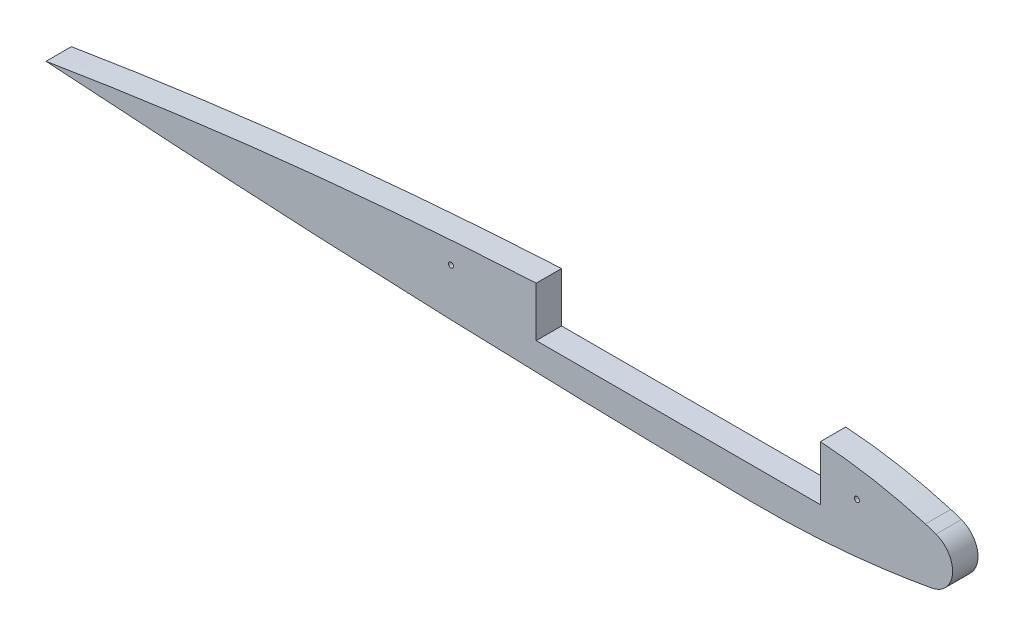
ISO-10303-21;
HEADER;
FILE_DESCRIPTION(('STEP AP214'),'2;1');
FILE_NAME('part.step','',(''),(''),'','','');
FILE_SCHEMA(('AUTOMOTIVE_DESIGN { 1 0 10303 214 1 1 1 1 }'));
ENDSEC;
DATA;
#1=APPLICATION_CONTEXT('core data for automotive mechanical design processes');
#2=APPLICATION_PROTOCOL_DEFINITION('international standard','automotive_design',2000,#1);
#3=PRODUCT_CONTEXT('',#1,'mechanical');
#4=PRODUCT('Part','Part','',(#3));
#5=PRODUCT_RELATED_PRODUCT_CATEGORY('part','',(#4));
#6=PRODUCT_DEFINITION_FORMATION('','',#4);
#7=PRODUCT_DEFINITION_CONTEXT('part definition',#1,'design');
#8=PRODUCT_DEFINITION('design','',#6,#7);
#9=PRODUCT_DEFINITION_SHAPE('','',#8);
#10=(LENGTH_UNIT() NAMED_UNIT(*) SI_UNIT(.MILLI.,.METRE.));
#11=(NAMED_UNIT(*) PLANE_ANGLE_UNIT() SI_UNIT($,.RADIAN.));
#12=(NAMED_UNIT(*) SI_UNIT($,.STERADIAN.) SOLID_ANGLE_UNIT());
#13=UNCERTAINTY_MEASURE_WITH_UNIT(LENGTH_MEASURE(1.E-05),#10,'distance_accuracy_value','');
#14=(GEOMETRIC_REPRESENTATION_CONTEXT(3) GLOBAL_UNCERTAINTY_ASSIGNED_CONTEXT((#13)) GLOBAL_UNIT_ASSIGNED_CONTEXT((#10,
#11,#12)) REPRESENTATION_CONTEXT('',''));
#15=CARTESIAN_POINT('',(0.,0.,0.));
#16=DIRECTION('',(0.,0.,1.));
#17=DIRECTION('',(1.,0.,0.));
#18=AXIS2_PLACEMENT_3D('',#15,#16,#17);
#19=CARTESIAN_POINT('',(36.2563303026578,-106.311961463395,-6.35));
#20=DIRECTION('',(0.,0.,-1.));
#21=DIRECTION('',(1.,0.,0.));
#22=AXIS2_PLACEMENT_3D('',#19,#20,#21);
#23=PLANE('',#22);
#24=CARTESIAN_POINT('',(-102.943690277273,19.812,-6.35));
#25=DIRECTION('',(0.,0.,1.));
#26=DIRECTION('',(1.,0.,0.));
#27=AXIS2_PLACEMENT_3D('',#24,#25,#26);
#28=CIRCLE('',#27,0.635000000000002);
#29=CARTESIAN_POINT('',(-102.308690277273,19.812,-6.35));
#30=VERTEX_POINT('',#29);
#31=EDGE_CURVE('E255',#30,#30,#28,.T.);
#32=ORIENTED_EDGE('',*,*,#31,.T.);
#33=EDGE_LOOP('',(#32));
#34=FACE_BOUND('',#33,.T.);
#35=CARTESIAN_POINT('',(-1.34369027727303,19.812,-6.35));
#36=DIRECTION('',(0.,0.,1.));
#37=DIRECTION('',(1.,0.,0.));
#38=AXIS2_PLACEMENT_3D('',#35,#36,#37);
#39=CIRCLE('',#38,0.634999999999998);
#40=CARTESIAN_POINT('',(-0.708690277273036,19.812,-6.35));
#41=VERTEX_POINT('',#40);
#42=EDGE_CURVE('E153',#41,#41,#39,.T.);
#43=ORIENTED_EDGE('',*,*,#42,.T.);
#44=EDGE_LOOP('',(#43));
#45=FACE_BOUND('',#44,.T.);
#46=DIRECTION('',(0.,1.,0.));
#47=VECTOR('',#46,1.);
#48=CARTESIAN_POINT('',(-81.607690277273,25.527,-6.35));
#49=LINE('',#48,#47);
#50=CARTESIAN_POINT('',(-81.607690277273,14.097,-6.35));
#51=VERTEX_POINT('',#50);
#52=CARTESIAN_POINT('',(-81.6076902772731,26.5483149903039,-6.35));
#53=VERTEX_POINT('',#52);
#54=EDGE_CURVE('E124',#51,#53,#49,.T.);
#55=ORIENTED_EDGE('',*,*,#54,.F.);
#56=DIRECTION('',(-1.,0.,0.));
#57=VECTOR('',#56,1.);
#58=CARTESIAN_POINT('',(-10.487690277273,14.097,-6.35));
#59=LINE('',#58,#57);
#60=CARTESIAN_POINT('',(-10.487690277273,14.097,-6.35));
#61=VERTEX_POINT('',#60);
#62=EDGE_CURVE('E135',#61,#51,#59,.T.);
#63=ORIENTED_EDGE('',*,*,#62,.F.);
#64=DIRECTION('',(0.,-1.,0.));
#65=VECTOR('',#64,1.);
#66=CARTESIAN_POINT('',(-10.487690277273,25.527,-6.35));
#67=LINE('',#66,#65);
#68=CARTESIAN_POINT('',(-10.487690277273,27.7567044479627,-6.35));
#69=VERTEX_POINT('',#68);
#70=EDGE_CURVE('E140',#69,#61,#67,.T.);
#71=ORIENTED_EDGE('',*,*,#70,.F.);
#72=CARTESIAN_POINT('',(-19.0703046319003,-78.8031868962383,-6.35));
#73=DIRECTION('',(0.,0.,1.));
#74=DIRECTION('',(1.,0.,0.));
#75=AXIS2_PLACEMENT_3D('',#72,#73,#74);
#76=ELLIPSE('',#75,115.248564949124,106.85660868282);
#77=CARTESIAN_POINT('',(15.7959364600178,23.0460792093641,-6.35));
#78=VERTEX_POINT('',#77);
#79=EDGE_CURVE('E129',#78,#69,#76,.T.);
#80=ORIENTED_EDGE('',*,*,#79,.F.);
#81=CARTESIAN_POINT('',(3.66991363984412,-12.3757639930228,-6.35));
#82=DIRECTION('',(0.,0.,1.));
#83=DIRECTION('',(1.,0.,0.));
#84=AXIS2_PLACEMENT_3D('',#81,#82,#83);
#85=ELLIPSE('',#84,40.081944161436,37.1633314861309);
#86=CARTESIAN_POINT('',(18.4537211022759,22.1672950178809,-6.35));
#87=VERTEX_POINT('',#86);
#88=EDGE_CURVE('E250',#87,#78,#85,.T.);
#89=ORIENTED_EDGE('',*,*,#88,.F.);
#90=CARTESIAN_POINT('',(16.2611044000867,16.2078544403366,-6.35));
#91=DIRECTION('',(0.,0.,1.));
#92=DIRECTION('',(1.,0.,0.));
#93=AXIS2_PLACEMENT_3D('',#90,#91,#92);
#94=CIRCLE('',#93,6.35);
#95=CARTESIAN_POINT('',(17.4084463771385,9.96236755878013,-6.35));
#96=VERTEX_POINT('',#95);
#97=EDGE_CURVE('E11',#96,#87,#94,.T.);
#98=ORIENTED_EDGE('',*,*,#97,.F.);
#99=CARTESIAN_POINT('',(-25.2914630612763,209.779210174929,-6.35));
#100=DIRECTION('',(0.,0.,1.));
#101=DIRECTION('',(1.,0.,0.));
#102=AXIS2_PLACEMENT_3D('',#99,#100,#101);
#103=ELLIPSE('',#102,219.69885466917,203.701230916069);
#104=CARTESIAN_POINT('',(-28.2927042476808,6.09698698342909,-6.35));
#105=VERTEX_POINT('',#104);
#106=EDGE_CURVE('E277',#105,#96,#103,.T.);
#107=ORIENTED_EDGE('',*,*,#106,.F.);
#108=CARTESIAN_POINT('',(3.97070538947494,2195.69893856267,-6.35));
#109=DIRECTION('',(0.,0.,1.));
#110=DIRECTION('',(0.999969321883776,-0.00783296184731889,0.));
#111=AXIS2_PLACEMENT_3D('',#108,#109,#110);
#112=ELLIPSE('',#111,2616.55390755447,2189.82401671418);
#113=CARTESIAN_POINT('',(-204.294256369334,13.2914062198968,-6.35));
#114=VERTEX_POINT('',#113);
#115=EDGE_CURVE('E127',#114,#105,#112,.T.);
#116=ORIENTED_EDGE('',*,*,#115,.F.);
#117=CARTESIAN_POINT('',(-23.5090756810409,-930.341693913225,-6.35));
#118=DIRECTION('',(0.,0.,1.));
#119=DIRECTION('',(1.,0.,0.));
#120=AXIS2_PLACEMENT_3D('',#117,#118,#119);
#121=ELLIPSE('',#120,1033.67315590804,958.405061057029);
#122=EDGE_CURVE('E116',#53,#114,#121,.T.);
#123=ORIENTED_EDGE('',*,*,#122,.F.);
#124=EDGE_LOOP('',(#55,#63,#71,#80,#89,#98,#107,#116,#123));
#125=FACE_BOUND('',#124,.T.);
#126=ADVANCED_FACE('F38',(#34,#45,#125),#23,.T.);
#127=CARTESIAN_POINT('',(36.2563303026578,-106.311961463395,0.));
#128=DIRECTION('',(0.,0.,-1.));
#129=DIRECTION('',(1.,0.,0.));
#130=AXIS2_PLACEMENT_3D('',#127,#128,#129);
#131=PLANE('',#130);
#132=CARTESIAN_POINT('',(-102.943690277273,19.812,0.));
#133=DIRECTION('',(0.,0.,1.));
#134=DIRECTION('',(1.,0.,0.));
#135=AXIS2_PLACEMENT_3D('',#132,#133,#134);
#136=CIRCLE('',#135,0.635000000000002);
#137=CARTESIAN_POINT('',(-102.308690277273,19.812,0.));
#138=VERTEX_POINT('',#137);
#139=EDGE_CURVE('E220',#138,#138,#136,.T.);
#140=ORIENTED_EDGE('',*,*,#139,.F.);
#141=EDGE_LOOP('',(#140));
#142=FACE_BOUND('',#141,.T.);
#143=CARTESIAN_POINT('',(-1.34369027727303,19.812,0.));
#144=DIRECTION('',(0.,0.,1.));
#145=DIRECTION('',(1.,0.,0.));
#146=AXIS2_PLACEMENT_3D('',#143,#144,#145);
#147=CIRCLE('',#146,0.634999999999998);
#148=CARTESIAN_POINT('',(-0.708690277273036,19.812,0.));
#149=VERTEX_POINT('',#148);
#150=EDGE_CURVE('E223',#149,#149,#147,.T.);
#151=ORIENTED_EDGE('',*,*,#150,.F.);
#152=EDGE_LOOP('',(#151));
#153=FACE_BOUND('',#152,.T.);
#154=CARTESIAN_POINT('',(-23.5090756810409,-930.341693913225,0.));
#155=DIRECTION('',(0.,0.,1.));
#156=DIRECTION('',(1.,0.,0.));
#157=AXIS2_PLACEMENT_3D('',#154,#155,#156);
#158=ELLIPSE('',#157,1033.67315590804,958.405061057029);
#159=CARTESIAN_POINT('',(-81.6076902772731,26.5483149903039,0.));
#160=VERTEX_POINT('',#159);
#161=CARTESIAN_POINT('',(-204.294256369334,13.2914062198968,0.));
#162=VERTEX_POINT('',#161);
#163=EDGE_CURVE('E119',#160,#162,#158,.T.);
#164=ORIENTED_EDGE('',*,*,#163,.T.);
#165=CARTESIAN_POINT('',(3.97070538947494,2195.69893856267,0.));
#166=DIRECTION('',(0.,0.,1.));
#167=DIRECTION('',(0.999969321883776,-0.00783296184731889,0.));
#168=AXIS2_PLACEMENT_3D('',#165,#166,#167);
#169=ELLIPSE('',#168,2616.55390755447,2189.82401671418);
#170=CARTESIAN_POINT('',(-28.2927042476808,6.09698698342909,0.));
#171=VERTEX_POINT('',#170);
#172=EDGE_CURVE('E227',#162,#171,#169,.T.);
#173=ORIENTED_EDGE('',*,*,#172,.T.);
#174=CARTESIAN_POINT('',(-25.2914630612763,209.779210174929,0.));
#175=DIRECTION('',(0.,0.,1.));
#176=DIRECTION('',(1.,0.,0.));
#177=AXIS2_PLACEMENT_3D('',#174,#175,#176);
#178=ELLIPSE('',#177,219.69885466917,203.701230916069);
#179=CARTESIAN_POINT('',(17.4084463771385,9.96236755878013,0.));
#180=VERTEX_POINT('',#179);
#181=EDGE_CURVE('E233',#171,#180,#178,.T.);
#182=ORIENTED_EDGE('',*,*,#181,.T.);
#183=CARTESIAN_POINT('',(16.2611044000867,16.2078544403366,0.));
#184=DIRECTION('',(0.,0.,1.));
#185=DIRECTION('',(1.,0.,0.));
#186=AXIS2_PLACEMENT_3D('',#183,#184,#185);
#187=CIRCLE('',#186,6.35);
#188=CARTESIAN_POINT('',(18.4537211022759,22.1672950178809,0.));
#189=VERTEX_POINT('',#188);
#190=EDGE_CURVE('E268',#189,#180,#187,.F.);
#191=ORIENTED_EDGE('',*,*,#190,.F.);
#192=CARTESIAN_POINT('',(3.66991363984412,-12.3757639930228,0.));
#193=DIRECTION('',(0.,0.,1.));
#194=DIRECTION('',(1.,0.,0.));
#195=AXIS2_PLACEMENT_3D('',#192,#193,#194);
#196=ELLIPSE('',#195,40.081944161436,37.1633314861309);
#197=CARTESIAN_POINT('',(15.7959364600178,23.0460792093641,0.));
#198=VERTEX_POINT('',#197);
#199=EDGE_CURVE('E178',#189,#198,#196,.T.);
#200=ORIENTED_EDGE('',*,*,#199,.T.);
#201=CARTESIAN_POINT('',(-19.0703046319003,-78.8031868962383,0.));
#202=DIRECTION('',(0.,0.,1.));
#203=DIRECTION('',(1.,0.,0.));
#204=AXIS2_PLACEMENT_3D('',#201,#202,#203);
#205=ELLIPSE('',#204,115.248564949124,106.85660868282);
#206=CARTESIAN_POINT('',(-10.487690277273,27.7567044479627,0.));
#207=VERTEX_POINT('',#206);
#208=EDGE_CURVE('E173',#198,#207,#205,.T.);
#209=ORIENTED_EDGE('',*,*,#208,.T.);
#210=DIRECTION('',(0.,-1.,0.));
#211=VECTOR('',#210,1.);
#212=CARTESIAN_POINT('',(-10.487690277273,25.527,0.));
#213=LINE('',#212,#211);
#214=CARTESIAN_POINT('',(-10.487690277273,14.097,0.));
#215=VERTEX_POINT('',#214);
#216=EDGE_CURVE('E148',#207,#215,#213,.T.);
#217=ORIENTED_EDGE('',*,*,#216,.T.);
#218=DIRECTION('',(-1.,0.,0.));
#219=VECTOR('',#218,1.);
#220=CARTESIAN_POINT('',(-10.487690277273,14.097,0.));
#221=LINE('',#220,#219);
#222=CARTESIAN_POINT('',(-81.607690277273,14.097,0.));
#223=VERTEX_POINT('',#222);
#224=EDGE_CURVE('E152',#215,#223,#221,.T.);
#225=ORIENTED_EDGE('',*,*,#224,.T.);
#226=DIRECTION('',(0.,1.,0.));
#227=VECTOR('',#226,1.);
#228=CARTESIAN_POINT('',(-81.607690277273,25.527,0.));
#229=LINE('',#228,#227);
#230=EDGE_CURVE('E156',#223,#160,#229,.T.);
#231=ORIENTED_EDGE('',*,*,#230,.T.);
#232=EDGE_LOOP('',(#164,#173,#182,#191,#200,#209,#217,#225,#231));
#233=FACE_BOUND('',#232,.T.);
#234=ADVANCED_FACE('F190',(#142,#153,#233),#131,.F.);
#235=DIRECTION('',(0.,0.,1.));
#236=VECTOR('',#235,1.);
#237=SURFACE_OF_LINEAR_EXTRUSION('',#76,#236);
#238=DIRECTION('',(0.,0.,1.));
#239=VECTOR('',#238,1.);
#240=CARTESIAN_POINT('',(-10.487690277273,27.7567044479627,-6.35));
#241=LINE('',#240,#239);
#242=EDGE_CURVE('E56',#69,#207,#241,.T.);
#243=ORIENTED_EDGE('',*,*,#242,.T.);
#244=ORIENTED_EDGE('',*,*,#208,.F.);
#245=DIRECTION('',(0.,0.,1.));
#246=VECTOR('',#245,1.);
#247=CARTESIAN_POINT('',(15.7959364600178,23.0460792093641,-6.35));
#248=LINE('',#247,#246);
#249=EDGE_CURVE('E247',#78,#198,#248,.T.);
#250=ORIENTED_EDGE('',*,*,#249,.F.);
#251=ORIENTED_EDGE('',*,*,#79,.T.);
#252=EDGE_LOOP('',(#243,#244,#250,#251));
#253=FACE_BOUND('',#252,.T.);
#254=ADVANCED_FACE('F186',(#253),#237,.T.);
#255=DIRECTION('',(0.,0.,1.));
#256=VECTOR('',#255,1.);
#257=SURFACE_OF_LINEAR_EXTRUSION('',#121,#256);
#258=DIRECTION('',(0.,0.,1.));
#259=VECTOR('',#258,1.);
#260=CARTESIAN_POINT('',(-81.6076902772731,26.5483149903039,-6.35));
#261=LINE('',#260,#259);
#262=EDGE_CURVE('E64',#53,#160,#261,.T.);
#263=ORIENTED_EDGE('',*,*,#262,.F.);
#264=ORIENTED_EDGE('',*,*,#122,.T.);
#265=DIRECTION('',(0.,0.,1.));
#266=VECTOR('',#265,1.);
#267=CARTESIAN_POINT('',(-204.294256369334,13.2914062198968,-6.35));
#268=LINE('',#267,#266);
#269=EDGE_CURVE('E252',#114,#162,#268,.T.);
#270=ORIENTED_EDGE('',*,*,#269,.T.);
#271=ORIENTED_EDGE('',*,*,#163,.F.);
#272=EDGE_LOOP('',(#263,#264,#270,#271));
#273=FACE_BOUND('',#272,.T.);
#274=ADVANCED_FACE('F115',(#273),#257,.T.);
#275=CARTESIAN_POINT('',(-10.487690277273,25.527,-6.35));
#276=DIRECTION('',(1.,0.,0.));
#277=DIRECTION('',(0.,0.,1.));
#278=AXIS2_PLACEMENT_3D('',#275,#276,#277);
#279=PLANE('',#278);
#280=ORIENTED_EDGE('',*,*,#216,.F.);
#281=ORIENTED_EDGE('',*,*,#242,.F.);
#282=ORIENTED_EDGE('',*,*,#70,.T.);
#283=DIRECTION('',(0.,0.,1.));
#284=VECTOR('',#283,1.);
#285=CARTESIAN_POINT('',(-10.487690277273,14.097,-6.35));
#286=LINE('',#285,#284);
#287=EDGE_CURVE('E134',#61,#215,#286,.T.);
#288=ORIENTED_EDGE('',*,*,#287,.T.);
#289=EDGE_LOOP('',(#280,#281,#282,#288));
#290=FACE_BOUND('',#289,.T.);
#291=ADVANCED_FACE('F205',(#290),#279,.F.);
#292=CARTESIAN_POINT('',(-81.607690277273,25.527,-6.35));
#293=DIRECTION('',(-1.,0.,0.));
#294=DIRECTION('',(0.,0.,-1.));
#295=AXIS2_PLACEMENT_3D('',#292,#293,#294);
#296=PLANE('',#295);
#297=ORIENTED_EDGE('',*,*,#230,.F.);
#298=DIRECTION('',(0.,0.,1.));
#299=VECTOR('',#298,1.);
#300=CARTESIAN_POINT('',(-81.607690277273,14.097,-6.35));
#301=LINE('',#300,#299);
#302=EDGE_CURVE('E132',#51,#223,#301,.T.);
#303=ORIENTED_EDGE('',*,*,#302,.F.);
#304=ORIENTED_EDGE('',*,*,#54,.T.);
#305=ORIENTED_EDGE('',*,*,#262,.T.);
#306=EDGE_LOOP('',(#297,#303,#304,#305));
#307=FACE_BOUND('',#306,.T.);
#308=ADVANCED_FACE('F131',(#307),#296,.F.);
#309=CARTESIAN_POINT('',(-10.487690277273,14.097,-6.35));
#310=DIRECTION('',(0.,-1.,0.));
#311=DIRECTION('',(0.,0.,1.));
#312=AXIS2_PLACEMENT_3D('',#309,#310,#311);
#313=PLANE('',#312);
#314=ORIENTED_EDGE('',*,*,#224,.F.);
#315=ORIENTED_EDGE('',*,*,#287,.F.);
#316=ORIENTED_EDGE('',*,*,#62,.T.);
#317=ORIENTED_EDGE('',*,*,#302,.T.);
#318=EDGE_LOOP('',(#314,#315,#316,#317));
#319=FACE_BOUND('',#318,.T.);
#320=ADVANCED_FACE('F201',(#319),#313,.F.);
#321=CARTESIAN_POINT('',(-1.34369027727303,19.812,-6.35));
#322=DIRECTION('',(0.,0.,1.));
#323=DIRECTION('',(-1.,0.,0.));
#324=AXIS2_PLACEMENT_3D('',#321,#322,#323);
#325=CYLINDRICAL_SURFACE('',#324,0.634999999999998);
#326=ORIENTED_EDGE('',*,*,#42,.F.);
#327=EDGE_LOOP('',(#326));
#328=FACE_BOUND('',#327,.T.);
#329=ORIENTED_EDGE('',*,*,#150,.T.);
#330=EDGE_LOOP('',(#329));
#331=FACE_BOUND('',#330,.T.);
#332=ADVANCED_FACE('F197',(#328,#331),#325,.F.);
#333=CARTESIAN_POINT('',(-102.943690277273,19.812,-6.35));
#334=DIRECTION('',(0.,0.,1.));
#335=DIRECTION('',(-1.,0.,0.));
#336=AXIS2_PLACEMENT_3D('',#333,#334,#335);
#337=CYLINDRICAL_SURFACE('',#336,0.635000000000002);
#338=ORIENTED_EDGE('',*,*,#31,.F.);
#339=EDGE_LOOP('',(#338));
#340=FACE_BOUND('',#339,.T.);
#341=ORIENTED_EDGE('',*,*,#139,.T.);
#342=EDGE_LOOP('',(#341));
#343=FACE_BOUND('',#342,.T.);
#344=ADVANCED_FACE('F193',(#340,#343),#337,.F.);
#345=DIRECTION('',(0.,0.,1.));
#346=VECTOR('',#345,1.);
#347=SURFACE_OF_LINEAR_EXTRUSION('',#112,#346);
#348=ORIENTED_EDGE('',*,*,#172,.F.);
#349=ORIENTED_EDGE('',*,*,#269,.F.);
#350=ORIENTED_EDGE('',*,*,#115,.T.);
#351=DIRECTION('',(0.,0.,1.));
#352=VECTOR('',#351,1.);
#353=CARTESIAN_POINT('',(-28.2927042476808,6.09698698342909,-6.35));
#354=LINE('',#353,#352);
#355=EDGE_CURVE('E249',#105,#171,#354,.T.);
#356=ORIENTED_EDGE('',*,*,#355,.T.);
#357=EDGE_LOOP('',(#348,#349,#350,#356));
#358=FACE_BOUND('',#357,.T.);
#359=ADVANCED_FACE('F196',(#358),#347,.T.);
#360=DIRECTION('',(0.,0.,1.));
#361=VECTOR('',#360,1.);
#362=SURFACE_OF_LINEAR_EXTRUSION('',#103,#361);
#363=ORIENTED_EDGE('',*,*,#181,.F.);
#364=ORIENTED_EDGE('',*,*,#355,.F.);
#365=ORIENTED_EDGE('',*,*,#106,.T.);
#366=DIRECTION('',(0.,0.,1.));
#367=VECTOR('',#366,1.);
#368=CARTESIAN_POINT('',(17.4084463771385,9.96236755878013,0.));
#369=LINE('',#368,#367);
#370=EDGE_CURVE('E48',#180,#96,#369,.F.);
#371=ORIENTED_EDGE('',*,*,#370,.F.);
#372=EDGE_LOOP('',(#363,#364,#365,#371));
#373=FACE_BOUND('',#372,.T.);
#374=ADVANCED_FACE('F278',(#373),#362,.T.);
#375=DIRECTION('',(0.,0.,1.));
#376=VECTOR('',#375,1.);
#377=SURFACE_OF_LINEAR_EXTRUSION('',#85,#376);
#378=ORIENTED_EDGE('',*,*,#88,.T.);
#379=ORIENTED_EDGE('',*,*,#249,.T.);
#380=ORIENTED_EDGE('',*,*,#199,.F.);
#381=DIRECTION('',(0.,0.,1.));
#382=VECTOR('',#381,1.);
#383=CARTESIAN_POINT('',(18.4537211022759,22.1672950178809,-6.35));
#384=LINE('',#383,#382);
#385=EDGE_CURVE('E264',#87,#189,#384,.T.);
#386=ORIENTED_EDGE('',*,*,#385,.F.);
#387=EDGE_LOOP('',(#378,#379,#380,#386));
#388=FACE_BOUND('',#387,.T.);
#389=ADVANCED_FACE('F288',(#388),#377,.T.);
#390=CARTESIAN_POINT('',(16.2611044000867,16.2078544403366,-3.175));
#391=DIRECTION('',(0.,0.,1.));
#392=DIRECTION('',(-1.,0.,0.));
#393=AXIS2_PLACEMENT_3D('',#390,#391,#392);
#394=CYLINDRICAL_SURFACE('',#393,6.35);
#395=ORIENTED_EDGE('',*,*,#97,.T.);
#396=ORIENTED_EDGE('',*,*,#385,.T.);
#397=ORIENTED_EDGE('',*,*,#190,.T.);
#398=ORIENTED_EDGE('',*,*,#370,.T.);
#399=EDGE_LOOP('',(#395,#396,#397,#398));
#400=FACE_BOUND('',#399,.T.);
#401=ADVANCED_FACE('F40',(#400),#394,.T.);
#402=CLOSED_SHELL('',(#126,#234,#254,#274,#291,#308,#320,#332,#344,#359,#374,#389,#401));
#403=MANIFOLD_SOLID_BREP('B2',#402);
#404=ADVANCED_BREP_SHAPE_REPRESENTATION('',(#18,#403),#14);
#405=SHAPE_DEFINITION_REPRESENTATION(#9,#404);
ENDSEC;
END-ISO-10303-21;
